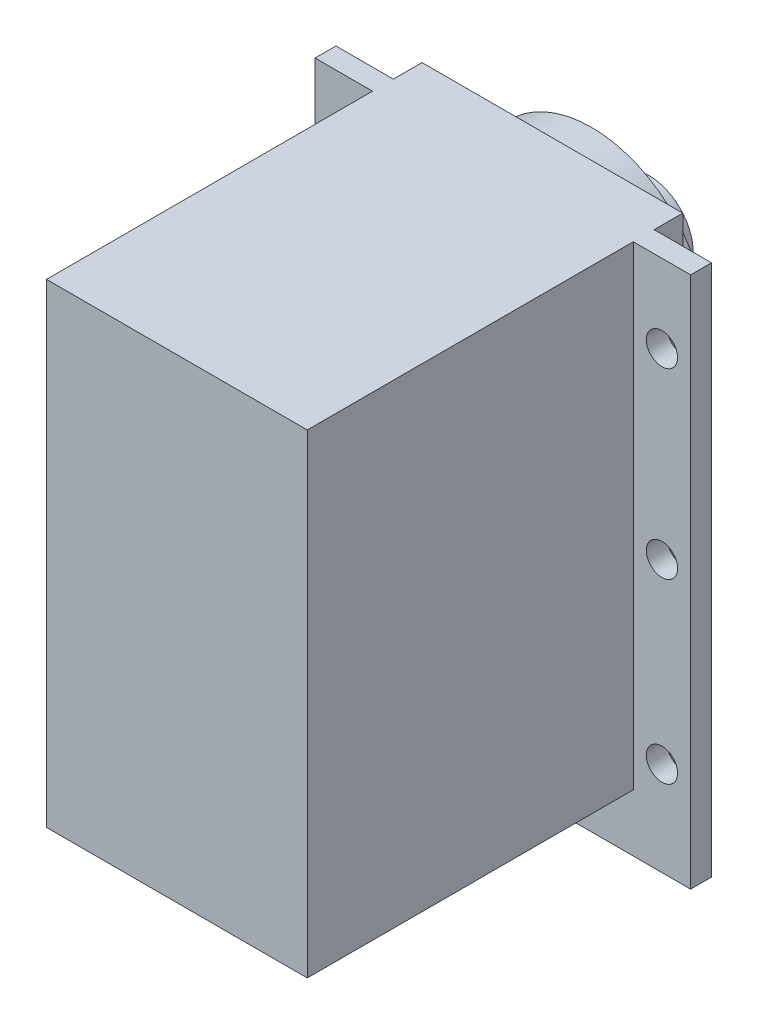
ISO-10303-21;
HEADER;
FILE_DESCRIPTION(('STEP AP214'),'2;1');
FILE_NAME('part.step','',(''),(''),'','','');
FILE_SCHEMA(('AUTOMOTIVE_DESIGN { 1 0 10303 214 1 1 1 1 }'));
ENDSEC;
DATA;
#1=APPLICATION_CONTEXT('core data for automotive mechanical design processes');
#2=APPLICATION_PROTOCOL_DEFINITION('international standard','automotive_design',2000,#1);
#3=PRODUCT_CONTEXT('',#1,'mechanical');
#4=PRODUCT('Part','Part','',(#3));
#5=PRODUCT_RELATED_PRODUCT_CATEGORY('part','',(#4));
#6=PRODUCT_DEFINITION_FORMATION('','',#4);
#7=PRODUCT_DEFINITION_CONTEXT('part definition',#1,'design');
#8=PRODUCT_DEFINITION('design','',#6,#7);
#9=PRODUCT_DEFINITION_SHAPE('','',#8);
#10=(LENGTH_UNIT() NAMED_UNIT(*) SI_UNIT(.MILLI.,.METRE.));
#11=(NAMED_UNIT(*) PLANE_ANGLE_UNIT() SI_UNIT($,.RADIAN.));
#12=(NAMED_UNIT(*) SI_UNIT($,.STERADIAN.) SOLID_ANGLE_UNIT());
#13=UNCERTAINTY_MEASURE_WITH_UNIT(LENGTH_MEASURE(1.E-05),#10,'distance_accuracy_value','');
#14=(GEOMETRIC_REPRESENTATION_CONTEXT(3) GLOBAL_UNCERTAINTY_ASSIGNED_CONTEXT((#13)) GLOBAL_UNIT_ASSIGNED_CONTEXT((#10,
#11,#12)) REPRESENTATION_CONTEXT('',''));
#15=CARTESIAN_POINT('',(0.,0.,0.));
#16=DIRECTION('',(0.,0.,1.));
#17=DIRECTION('',(1.,0.,0.));
#18=AXIS2_PLACEMENT_3D('',#15,#16,#17);
#19=CARTESIAN_POINT('',(12.5,-22.75,36.));
#20=DIRECTION('',(-1.,0.,0.));
#21=DIRECTION('',(0.,0.,1.));
#22=AXIS2_PLACEMENT_3D('',#19,#20,#21);
#23=PLANE('',#22);
#24=DIRECTION('',(0.,-1.,0.));
#25=VECTOR('',#24,1.);
#26=CARTESIAN_POINT('',(12.5,-22.75,4.75));
#27=LINE('',#26,#25);
#28=CARTESIAN_POINT('',(12.5,22.75,4.75));
#29=VERTEX_POINT('',#28);
#30=CARTESIAN_POINT('',(12.5,-22.75,4.75));
#31=VERTEX_POINT('',#30);
#32=EDGE_CURVE('E185',#29,#31,#27,.T.);
#33=ORIENTED_EDGE('',*,*,#32,.F.);
#34=DIRECTION('',(0.,0.,-1.));
#35=VECTOR('',#34,1.);
#36=CARTESIAN_POINT('',(12.5,22.75,36.));
#37=LINE('',#36,#35);
#38=CARTESIAN_POINT('',(12.5,22.75,36.));
#39=VERTEX_POINT('',#38);
#40=EDGE_CURVE('E215',#39,#29,#37,.T.);
#41=ORIENTED_EDGE('',*,*,#40,.F.);
#42=DIRECTION('',(0.,1.,0.));
#43=VECTOR('',#42,1.);
#44=CARTESIAN_POINT('',(12.5,-22.75,36.));
#45=LINE('',#44,#43);
#46=CARTESIAN_POINT('',(12.5,-22.75,36.));
#47=VERTEX_POINT('',#46);
#48=EDGE_CURVE('E188',#47,#39,#45,.T.);
#49=ORIENTED_EDGE('',*,*,#48,.F.);
#50=DIRECTION('',(0.,0.,-1.));
#51=VECTOR('',#50,1.);
#52=CARTESIAN_POINT('',(12.5,-22.75,36.));
#53=LINE('',#52,#51);
#54=EDGE_CURVE('E203',#47,#31,#53,.T.);
#55=ORIENTED_EDGE('',*,*,#54,.T.);
#56=EDGE_LOOP('',(#33,#41,#49,#55));
#57=FACE_BOUND('',#56,.T.);
#58=ADVANCED_FACE('F32',(#57),#23,.F.);
#59=CARTESIAN_POINT('',(-12.5,-22.75,36.));
#60=DIRECTION('',(1.,0.,0.));
#61=DIRECTION('',(0.,0.,-1.));
#62=AXIS2_PLACEMENT_3D('',#59,#60,#61);
#63=PLANE('',#62);
#64=DIRECTION('',(0.,1.,0.));
#65=VECTOR('',#64,1.);
#66=CARTESIAN_POINT('',(-12.5,-22.75,4.75));
#67=LINE('',#66,#65);
#68=CARTESIAN_POINT('',(-12.5,-22.75,4.75));
#69=VERTEX_POINT('',#68);
#70=CARTESIAN_POINT('',(-12.5,22.75,4.75));
#71=VERTEX_POINT('',#70);
#72=EDGE_CURVE('E183',#69,#71,#67,.T.);
#73=ORIENTED_EDGE('',*,*,#72,.F.);
#74=DIRECTION('',(0.,0.,-1.));
#75=VECTOR('',#74,1.);
#76=CARTESIAN_POINT('',(-12.5,-22.75,36.));
#77=LINE('',#76,#75);
#78=CARTESIAN_POINT('',(-12.5,-22.75,36.));
#79=VERTEX_POINT('',#78);
#80=EDGE_CURVE('E207',#79,#69,#77,.T.);
#81=ORIENTED_EDGE('',*,*,#80,.F.);
#82=DIRECTION('',(0.,-1.,0.));
#83=VECTOR('',#82,1.);
#84=CARTESIAN_POINT('',(-12.5,-22.75,36.));
#85=LINE('',#84,#83);
#86=CARTESIAN_POINT('',(-12.5,22.75,36.));
#87=VERTEX_POINT('',#86);
#88=EDGE_CURVE('E192',#87,#79,#85,.T.);
#89=ORIENTED_EDGE('',*,*,#88,.F.);
#90=DIRECTION('',(0.,0.,-1.));
#91=VECTOR('',#90,1.);
#92=CARTESIAN_POINT('',(-12.5,22.75,36.));
#93=LINE('',#92,#91);
#94=EDGE_CURVE('E211',#87,#71,#93,.T.);
#95=ORIENTED_EDGE('',*,*,#94,.T.);
#96=EDGE_LOOP('',(#73,#81,#89,#95));
#97=FACE_BOUND('',#96,.T.);
#98=ADVANCED_FACE('F240',(#97),#63,.F.);
#99=CARTESIAN_POINT('',(-12.5,-22.75,36.));
#100=DIRECTION('',(0.,1.,0.));
#101=DIRECTION('',(0.,0.,1.));
#102=AXIS2_PLACEMENT_3D('',#99,#100,#101);
#103=PLANE('',#102);
#104=DIRECTION('',(-1.,0.,0.));
#105=VECTOR('',#104,1.);
#106=CARTESIAN_POINT('',(-12.5,-22.75,4.75));
#107=LINE('',#106,#105);
#108=EDGE_CURVE('E11',#31,#69,#107,.T.);
#109=ORIENTED_EDGE('',*,*,#108,.F.);
#110=ORIENTED_EDGE('',*,*,#54,.F.);
#111=DIRECTION('',(1.,0.,0.));
#112=VECTOR('',#111,1.);
#113=CARTESIAN_POINT('',(-12.5,-22.75,36.));
#114=LINE('',#113,#112);
#115=EDGE_CURVE('E56',#79,#47,#114,.T.);
#116=ORIENTED_EDGE('',*,*,#115,.F.);
#117=ORIENTED_EDGE('',*,*,#80,.T.);
#118=EDGE_LOOP('',(#109,#110,#116,#117));
#119=FACE_BOUND('',#118,.T.);
#120=ADVANCED_FACE('F243',(#119),#103,.F.);
#121=CARTESIAN_POINT('',(12.5,22.75,2.75));
#122=VERTEX_POINT('',#121);
#123=CARTESIAN_POINT('',(12.5,22.75,0.));
#124=VERTEX_POINT('',#123);
#125=EDGE_CURVE('E214',#122,#124,#37,.T.);
#126=ORIENTED_EDGE('',*,*,#125,.F.);
#127=DIRECTION('',(0.,-1.,0.));
#128=VECTOR('',#127,1.);
#129=CARTESIAN_POINT('',(12.5,-22.75,2.75));
#130=LINE('',#129,#128);
#131=CARTESIAN_POINT('',(12.5,-22.75,2.75));
#132=VERTEX_POINT('',#131);
#133=EDGE_CURVE('E181',#122,#132,#130,.T.);
#134=ORIENTED_EDGE('',*,*,#133,.T.);
#135=CARTESIAN_POINT('',(12.5,-22.75,0.));
#136=VERTEX_POINT('',#135);
#137=EDGE_CURVE('E78',#132,#136,#53,.T.);
#138=ORIENTED_EDGE('',*,*,#137,.T.);
#139=DIRECTION('',(0.,1.,0.));
#140=VECTOR('',#139,1.);
#141=CARTESIAN_POINT('',(12.5,-22.75,0.));
#142=LINE('',#141,#140);
#143=EDGE_CURVE('E187',#136,#124,#142,.T.);
#144=ORIENTED_EDGE('',*,*,#143,.T.);
#145=EDGE_LOOP('',(#126,#134,#138,#144));
#146=FACE_BOUND('',#145,.T.);
#147=ADVANCED_FACE('F34',(#146),#23,.F.);
#148=CARTESIAN_POINT('',(-12.5,22.75,36.));
#149=DIRECTION('',(0.,-1.,0.));
#150=DIRECTION('',(0.,0.,-1.));
#151=AXIS2_PLACEMENT_3D('',#148,#149,#150);
#152=PLANE('',#151);
#153=CARTESIAN_POINT('',(-12.5,22.75,2.75));
#154=VERTEX_POINT('',#153);
#155=CARTESIAN_POINT('',(-12.5,22.75,0.));
#156=VERTEX_POINT('',#155);
#157=EDGE_CURVE('E210',#154,#156,#93,.T.);
#158=ORIENTED_EDGE('',*,*,#157,.F.);
#159=DIRECTION('',(1.,0.,0.));
#160=VECTOR('',#159,1.);
#161=CARTESIAN_POINT('',(18.,22.75,2.75));
#162=LINE('',#161,#160);
#163=CARTESIAN_POINT('',(-18.,22.75,2.75));
#164=VERTEX_POINT('',#163);
#165=EDGE_CURVE('E157',#164,#154,#162,.T.);
#166=ORIENTED_EDGE('',*,*,#165,.F.);
#167=DIRECTION('',(0.,0.,-1.));
#168=VECTOR('',#167,1.);
#169=CARTESIAN_POINT('',(-18.,22.75,4.75));
#170=LINE('',#169,#168);
#171=CARTESIAN_POINT('',(-18.,22.75,4.75));
#172=VERTEX_POINT('',#171);
#173=EDGE_CURVE('E177',#172,#164,#170,.T.);
#174=ORIENTED_EDGE('',*,*,#173,.F.);
#175=DIRECTION('',(1.,0.,0.));
#176=VECTOR('',#175,1.);
#177=CARTESIAN_POINT('',(18.,22.75,4.75));
#178=LINE('',#177,#176);
#179=EDGE_CURVE('E142',#172,#71,#178,.T.);
#180=ORIENTED_EDGE('',*,*,#179,.T.);
#181=ORIENTED_EDGE('',*,*,#94,.F.);
#182=DIRECTION('',(-1.,0.,0.));
#183=VECTOR('',#182,1.);
#184=CARTESIAN_POINT('',(-12.5,22.75,36.));
#185=LINE('',#184,#183);
#186=EDGE_CURVE('E86',#39,#87,#185,.T.);
#187=ORIENTED_EDGE('',*,*,#186,.F.);
#188=ORIENTED_EDGE('',*,*,#40,.T.);
#189=CARTESIAN_POINT('',(18.,22.75,4.75));
#190=VERTEX_POINT('',#189);
#191=EDGE_CURVE('E166',#29,#190,#178,.T.);
#192=ORIENTED_EDGE('',*,*,#191,.T.);
#193=DIRECTION('',(0.,0.,-1.));
#194=VECTOR('',#193,1.);
#195=CARTESIAN_POINT('',(18.,22.75,4.75));
#196=LINE('',#195,#194);
#197=CARTESIAN_POINT('',(18.,22.75,2.75));
#198=VERTEX_POINT('',#197);
#199=EDGE_CURVE('E156',#190,#198,#196,.T.);
#200=ORIENTED_EDGE('',*,*,#199,.T.);
#201=EDGE_CURVE('E159',#122,#198,#162,.T.);
#202=ORIENTED_EDGE('',*,*,#201,.F.);
#203=ORIENTED_EDGE('',*,*,#125,.T.);
#204=DIRECTION('',(-1.,0.,0.));
#205=VECTOR('',#204,1.);
#206=CARTESIAN_POINT('',(-12.5,22.75,0.));
#207=LINE('',#206,#205);
#208=EDGE_CURVE('E196',#124,#156,#207,.T.);
#209=ORIENTED_EDGE('',*,*,#208,.T.);
#210=EDGE_LOOP('',(#158,#166,#174,#180,#181,#187,#188,#192,#200,#202,#203,#209));
#211=FACE_BOUND('',#210,.T.);
#212=ADVANCED_FACE('F230',(#211),#152,.F.);
#213=CARTESIAN_POINT('',(-12.5,-22.75,2.75));
#214=VERTEX_POINT('',#213);
#215=CARTESIAN_POINT('',(-12.5,-22.75,0.));
#216=VERTEX_POINT('',#215);
#217=EDGE_CURVE('E206',#214,#216,#77,.T.);
#218=ORIENTED_EDGE('',*,*,#217,.F.);
#219=DIRECTION('',(0.,1.,0.));
#220=VECTOR('',#219,1.);
#221=CARTESIAN_POINT('',(-12.5,-22.75,2.75));
#222=LINE('',#221,#220);
#223=EDGE_CURVE('E47',#214,#154,#222,.T.);
#224=ORIENTED_EDGE('',*,*,#223,.T.);
#225=ORIENTED_EDGE('',*,*,#157,.T.);
#226=DIRECTION('',(0.,-1.,0.));
#227=VECTOR('',#226,1.);
#228=CARTESIAN_POINT('',(-12.5,-22.75,0.));
#229=LINE('',#228,#227);
#230=EDGE_CURVE('E199',#156,#216,#229,.T.);
#231=ORIENTED_EDGE('',*,*,#230,.T.);
#232=EDGE_LOOP('',(#218,#224,#225,#231));
#233=FACE_BOUND('',#232,.T.);
#234=ADVANCED_FACE('F220',(#233),#63,.F.);
#235=ORIENTED_EDGE('',*,*,#137,.F.);
#236=DIRECTION('',(-1.,0.,0.));
#237=VECTOR('',#236,1.);
#238=CARTESIAN_POINT('',(-12.5,-22.75,2.75));
#239=LINE('',#238,#237);
#240=EDGE_CURVE('E40',#132,#214,#239,.T.);
#241=ORIENTED_EDGE('',*,*,#240,.T.);
#242=ORIENTED_EDGE('',*,*,#217,.T.);
#243=DIRECTION('',(1.,0.,0.));
#244=VECTOR('',#243,1.);
#245=CARTESIAN_POINT('',(-12.5,-22.75,0.));
#246=LINE('',#245,#244);
#247=EDGE_CURVE('E190',#216,#136,#246,.T.);
#248=ORIENTED_EDGE('',*,*,#247,.T.);
#249=EDGE_LOOP('',(#235,#241,#242,#248));
#250=FACE_BOUND('',#249,.T.);
#251=ADVANCED_FACE('F218',(#250),#103,.F.);
#252=CARTESIAN_POINT('',(0.,0.,36.));
#253=DIRECTION('',(0.,0.,-1.));
#254=DIRECTION('',(-1.,0.,0.));
#255=AXIS2_PLACEMENT_3D('',#252,#253,#254);
#256=PLANE('',#255);
#257=ORIENTED_EDGE('',*,*,#48,.T.);
#258=ORIENTED_EDGE('',*,*,#186,.T.);
#259=ORIENTED_EDGE('',*,*,#88,.T.);
#260=ORIENTED_EDGE('',*,*,#115,.T.);
#261=EDGE_LOOP('',(#257,#258,#259,#260));
#262=FACE_BOUND('',#261,.T.);
#263=ADVANCED_FACE('F248',(#262),#256,.F.);
#264=CARTESIAN_POINT('',(0.,0.,0.));
#265=DIRECTION('',(0.,0.,-1.));
#266=DIRECTION('',(-1.,0.,0.));
#267=AXIS2_PLACEMENT_3D('',#264,#265,#266);
#268=PLANE('',#267);
#269=CARTESIAN_POINT('',(0.,10.75,0.));
#270=DIRECTION('',(0.,0.,-1.));
#271=DIRECTION('',(-1.,0.,0.));
#272=AXIS2_PLACEMENT_3D('',#269,#270,#271);
#273=CIRCLE('',#272,11.);
#274=CARTESIAN_POINT('',(-11.,10.75,0.));
#275=VERTEX_POINT('',#274);
#276=EDGE_CURVE('E668',#275,#275,#273,.T.);
#277=ORIENTED_EDGE('',*,*,#276,.F.);
#278=EDGE_LOOP('',(#277));
#279=FACE_BOUND('',#278,.T.);
#280=ORIENTED_EDGE('',*,*,#143,.F.);
#281=ORIENTED_EDGE('',*,*,#247,.F.);
#282=ORIENTED_EDGE('',*,*,#230,.F.);
#283=ORIENTED_EDGE('',*,*,#208,.F.);
#284=EDGE_LOOP('',(#280,#281,#282,#283));
#285=FACE_BOUND('',#284,.T.);
#286=ADVANCED_FACE('F227',(#279,#285),#268,.T.);
#287=CARTESIAN_POINT('',(0.,0.,4.75));
#288=DIRECTION('',(0.,0.,-1.));
#289=DIRECTION('',(-1.,0.,0.));
#290=AXIS2_PLACEMENT_3D('',#287,#288,#289);
#291=PLANE('',#290);
#292=CARTESIAN_POINT('',(-15.25,15.25,4.75));
#293=DIRECTION('',(0.,0.,-1.));
#294=DIRECTION('',(-1.,0.,0.));
#295=AXIS2_PLACEMENT_3D('',#292,#293,#294);
#296=CIRCLE('',#295,1.5);
#297=CARTESIAN_POINT('',(-16.75,15.25,4.75));
#298=VERTEX_POINT('',#297);
#299=EDGE_CURVE('E677',#298,#298,#296,.T.);
#300=ORIENTED_EDGE('',*,*,#299,.T.);
#301=EDGE_LOOP('',(#300));
#302=FACE_BOUND('',#301,.T.);
#303=CARTESIAN_POINT('',(-15.25,-2.25,4.75));
#304=DIRECTION('',(0.,0.,-1.));
#305=DIRECTION('',(-1.,0.,0.));
#306=AXIS2_PLACEMENT_3D('',#303,#304,#305);
#307=CIRCLE('',#306,1.5);
#308=CARTESIAN_POINT('',(-16.75,-2.25,4.75));
#309=VERTEX_POINT('',#308);
#310=EDGE_CURVE('E683',#309,#309,#307,.T.);
#311=ORIENTED_EDGE('',*,*,#310,.T.);
#312=EDGE_LOOP('',(#311));
#313=FACE_BOUND('',#312,.T.);
#314=CARTESIAN_POINT('',(-15.25,-19.25,4.75));
#315=DIRECTION('',(0.,0.,-1.));
#316=DIRECTION('',(-1.,0.,0.));
#317=AXIS2_PLACEMENT_3D('',#314,#315,#316);
#318=CIRCLE('',#317,1.5);
#319=CARTESIAN_POINT('',(-16.75,-19.25,4.75));
#320=VERTEX_POINT('',#319);
#321=EDGE_CURVE('E689',#320,#320,#318,.T.);
#322=ORIENTED_EDGE('',*,*,#321,.T.);
#323=EDGE_LOOP('',(#322));
#324=FACE_BOUND('',#323,.T.);
#325=CARTESIAN_POINT('',(-7.5,-25.5,4.75));
#326=DIRECTION('',(0.,0.,-1.));
#327=DIRECTION('',(-1.,0.,0.));
#328=AXIS2_PLACEMENT_3D('',#325,#326,#327);
#329=CIRCLE('',#328,1.5);
#330=CARTESIAN_POINT('',(-9.,-25.5,4.75));
#331=VERTEX_POINT('',#330);
#332=EDGE_CURVE('E695',#331,#331,#329,.T.);
#333=ORIENTED_EDGE('',*,*,#332,.T.);
#334=EDGE_LOOP('',(#333));
#335=FACE_BOUND('',#334,.T.);
#336=CARTESIAN_POINT('',(7.5,-25.5,4.75));
#337=DIRECTION('',(0.,0.,-1.));
#338=DIRECTION('',(-1.,0.,0.));
#339=AXIS2_PLACEMENT_3D('',#336,#337,#338);
#340=CIRCLE('',#339,1.5);
#341=CARTESIAN_POINT('',(6.,-25.5,4.75));
#342=VERTEX_POINT('',#341);
#343=EDGE_CURVE('E701',#342,#342,#340,.T.);
#344=ORIENTED_EDGE('',*,*,#343,.T.);
#345=EDGE_LOOP('',(#344));
#346=FACE_BOUND('',#345,.T.);
#347=CARTESIAN_POINT('',(15.25,-19.25,4.75));
#348=DIRECTION('',(0.,0.,-1.));
#349=DIRECTION('',(-1.,0.,0.));
#350=AXIS2_PLACEMENT_3D('',#347,#348,#349);
#351=CIRCLE('',#350,1.5);
#352=CARTESIAN_POINT('',(13.75,-19.25,4.75));
#353=VERTEX_POINT('',#352);
#354=EDGE_CURVE('E707',#353,#353,#351,.T.);
#355=ORIENTED_EDGE('',*,*,#354,.T.);
#356=EDGE_LOOP('',(#355));
#357=FACE_BOUND('',#356,.T.);
#358=CARTESIAN_POINT('',(15.25,-2.25,4.75));
#359=DIRECTION('',(0.,0.,-1.));
#360=DIRECTION('',(-1.,0.,0.));
#361=AXIS2_PLACEMENT_3D('',#358,#359,#360);
#362=CIRCLE('',#361,1.5);
#363=CARTESIAN_POINT('',(13.75,-2.25,4.75));
#364=VERTEX_POINT('',#363);
#365=EDGE_CURVE('E713',#364,#364,#362,.T.);
#366=ORIENTED_EDGE('',*,*,#365,.T.);
#367=EDGE_LOOP('',(#366));
#368=FACE_BOUND('',#367,.T.);
#369=CARTESIAN_POINT('',(15.25,15.25,4.75));
#370=DIRECTION('',(0.,0.,-1.));
#371=DIRECTION('',(-1.,0.,0.));
#372=AXIS2_PLACEMENT_3D('',#369,#370,#371);
#373=CIRCLE('',#372,1.5);
#374=CARTESIAN_POINT('',(13.75,15.25,4.75));
#375=VERTEX_POINT('',#374);
#376=EDGE_CURVE('E171',#375,#375,#373,.T.);
#377=ORIENTED_EDGE('',*,*,#376,.T.);
#378=EDGE_LOOP('',(#377));
#379=FACE_BOUND('',#378,.T.);
#380=ORIENTED_EDGE('',*,*,#191,.F.);
#381=ORIENTED_EDGE('',*,*,#32,.T.);
#382=ORIENTED_EDGE('',*,*,#108,.T.);
#383=ORIENTED_EDGE('',*,*,#72,.T.);
#384=ORIENTED_EDGE('',*,*,#179,.F.);
#385=DIRECTION('',(0.,1.,0.));
#386=VECTOR('',#385,1.);
#387=CARTESIAN_POINT('',(-18.,22.75,4.75));
#388=LINE('',#387,#386);
#389=CARTESIAN_POINT('',(-18.,-28.25,4.75));
#390=VERTEX_POINT('',#389);
#391=EDGE_CURVE('E151',#390,#172,#388,.T.);
#392=ORIENTED_EDGE('',*,*,#391,.F.);
#393=DIRECTION('',(-1.,0.,0.));
#394=VECTOR('',#393,1.);
#395=CARTESIAN_POINT('',(18.,-28.25,4.75));
#396=LINE('',#395,#394);
#397=CARTESIAN_POINT('',(18.,-28.25,4.75));
#398=VERTEX_POINT('',#397);
#399=EDGE_CURVE('E134',#398,#390,#396,.T.);
#400=ORIENTED_EDGE('',*,*,#399,.F.);
#401=DIRECTION('',(0.,-1.,0.));
#402=VECTOR('',#401,1.);
#403=CARTESIAN_POINT('',(18.,22.75,4.75));
#404=LINE('',#403,#402);
#405=EDGE_CURVE('E148',#190,#398,#404,.T.);
#406=ORIENTED_EDGE('',*,*,#405,.F.);
#407=EDGE_LOOP('',(#380,#381,#382,#383,#384,#392,#400,#406));
#408=FACE_BOUND('',#407,.T.);
#409=ADVANCED_FACE('F147',(#302,#313,#324,#335,#346,#357,#368,#379,#408),#291,.F.);
#410=CARTESIAN_POINT('',(0.,0.,2.75));
#411=DIRECTION('',(0.,0.,-1.));
#412=DIRECTION('',(-1.,0.,0.));
#413=AXIS2_PLACEMENT_3D('',#410,#411,#412);
#414=PLANE('',#413);
#415=CARTESIAN_POINT('',(15.25,15.25,2.75));
#416=DIRECTION('',(0.,0.,-1.));
#417=DIRECTION('',(-1.,0.,0.));
#418=AXIS2_PLACEMENT_3D('',#415,#416,#417);
#419=CIRCLE('',#418,1.5);
#420=CARTESIAN_POINT('',(13.75,15.25,2.75));
#421=VERTEX_POINT('',#420);
#422=EDGE_CURVE('E162',#421,#421,#419,.T.);
#423=ORIENTED_EDGE('',*,*,#422,.F.);
#424=EDGE_LOOP('',(#423));
#425=FACE_BOUND('',#424,.T.);
#426=CARTESIAN_POINT('',(15.25,-2.25,2.75));
#427=DIRECTION('',(0.,0.,-1.));
#428=DIRECTION('',(-1.,0.,0.));
#429=AXIS2_PLACEMENT_3D('',#426,#427,#428);
#430=CIRCLE('',#429,1.5);
#431=CARTESIAN_POINT('',(13.75,-2.25,2.75));
#432=VERTEX_POINT('',#431);
#433=EDGE_CURVE('E710',#432,#432,#430,.T.);
#434=ORIENTED_EDGE('',*,*,#433,.F.);
#435=EDGE_LOOP('',(#434));
#436=FACE_BOUND('',#435,.T.);
#437=CARTESIAN_POINT('',(15.25,-19.25,2.75));
#438=DIRECTION('',(0.,0.,-1.));
#439=DIRECTION('',(-1.,0.,0.));
#440=AXIS2_PLACEMENT_3D('',#437,#438,#439);
#441=CIRCLE('',#440,1.5);
#442=CARTESIAN_POINT('',(13.75,-19.25,2.75));
#443=VERTEX_POINT('',#442);
#444=EDGE_CURVE('E704',#443,#443,#441,.T.);
#445=ORIENTED_EDGE('',*,*,#444,.F.);
#446=EDGE_LOOP('',(#445));
#447=FACE_BOUND('',#446,.T.);
#448=CARTESIAN_POINT('',(7.5,-25.5,2.75));
#449=DIRECTION('',(0.,0.,-1.));
#450=DIRECTION('',(-1.,0.,0.));
#451=AXIS2_PLACEMENT_3D('',#448,#449,#450);
#452=CIRCLE('',#451,1.5);
#453=CARTESIAN_POINT('',(6.,-25.5,2.75));
#454=VERTEX_POINT('',#453);
#455=EDGE_CURVE('E698',#454,#454,#452,.T.);
#456=ORIENTED_EDGE('',*,*,#455,.F.);
#457=EDGE_LOOP('',(#456));
#458=FACE_BOUND('',#457,.T.);
#459=CARTESIAN_POINT('',(-7.5,-25.5,2.75));
#460=DIRECTION('',(0.,0.,-1.));
#461=DIRECTION('',(-1.,0.,0.));
#462=AXIS2_PLACEMENT_3D('',#459,#460,#461);
#463=CIRCLE('',#462,1.5);
#464=CARTESIAN_POINT('',(-9.,-25.5,2.75));
#465=VERTEX_POINT('',#464);
#466=EDGE_CURVE('E692',#465,#465,#463,.T.);
#467=ORIENTED_EDGE('',*,*,#466,.F.);
#468=EDGE_LOOP('',(#467));
#469=FACE_BOUND('',#468,.T.);
#470=CARTESIAN_POINT('',(-15.25,-19.25,2.75));
#471=DIRECTION('',(0.,0.,-1.));
#472=DIRECTION('',(-1.,0.,0.));
#473=AXIS2_PLACEMENT_3D('',#470,#471,#472);
#474=CIRCLE('',#473,1.5);
#475=CARTESIAN_POINT('',(-16.75,-19.25,2.75));
#476=VERTEX_POINT('',#475);
#477=EDGE_CURVE('E686',#476,#476,#474,.T.);
#478=ORIENTED_EDGE('',*,*,#477,.F.);
#479=EDGE_LOOP('',(#478));
#480=FACE_BOUND('',#479,.T.);
#481=CARTESIAN_POINT('',(-15.25,-2.25,2.75));
#482=DIRECTION('',(0.,0.,-1.));
#483=DIRECTION('',(-1.,0.,0.));
#484=AXIS2_PLACEMENT_3D('',#481,#482,#483);
#485=CIRCLE('',#484,1.5);
#486=CARTESIAN_POINT('',(-16.75,-2.25,2.75));
#487=VERTEX_POINT('',#486);
#488=EDGE_CURVE('E680',#487,#487,#485,.T.);
#489=ORIENTED_EDGE('',*,*,#488,.F.);
#490=EDGE_LOOP('',(#489));
#491=FACE_BOUND('',#490,.T.);
#492=CARTESIAN_POINT('',(-15.25,15.25,2.75));
#493=DIRECTION('',(0.,0.,-1.));
#494=DIRECTION('',(-1.,0.,0.));
#495=AXIS2_PLACEMENT_3D('',#492,#493,#494);
#496=CIRCLE('',#495,1.5);
#497=CARTESIAN_POINT('',(-16.75,15.25,2.75));
#498=VERTEX_POINT('',#497);
#499=EDGE_CURVE('E674',#498,#498,#496,.T.);
#500=ORIENTED_EDGE('',*,*,#499,.F.);
#501=EDGE_LOOP('',(#500));
#502=FACE_BOUND('',#501,.T.);
#503=ORIENTED_EDGE('',*,*,#133,.F.);
#504=ORIENTED_EDGE('',*,*,#201,.T.);
#505=DIRECTION('',(0.,-1.,0.));
#506=VECTOR('',#505,1.);
#507=CARTESIAN_POINT('',(18.,22.75,2.75));
#508=LINE('',#507,#506);
#509=CARTESIAN_POINT('',(18.,-28.25,2.75));
#510=VERTEX_POINT('',#509);
#511=EDGE_CURVE('E169',#198,#510,#508,.T.);
#512=ORIENTED_EDGE('',*,*,#511,.T.);
#513=DIRECTION('',(-1.,0.,0.));
#514=VECTOR('',#513,1.);
#515=CARTESIAN_POINT('',(18.,-28.25,2.75));
#516=LINE('',#515,#514);
#517=CARTESIAN_POINT('',(-18.,-28.25,2.75));
#518=VERTEX_POINT('',#517);
#519=EDGE_CURVE('E136',#510,#518,#516,.T.);
#520=ORIENTED_EDGE('',*,*,#519,.T.);
#521=DIRECTION('',(0.,1.,0.));
#522=VECTOR('',#521,1.);
#523=CARTESIAN_POINT('',(-18.,22.75,2.75));
#524=LINE('',#523,#522);
#525=EDGE_CURVE('E173',#518,#164,#524,.T.);
#526=ORIENTED_EDGE('',*,*,#525,.T.);
#527=ORIENTED_EDGE('',*,*,#165,.T.);
#528=ORIENTED_EDGE('',*,*,#223,.F.);
#529=ORIENTED_EDGE('',*,*,#240,.F.);
#530=EDGE_LOOP('',(#503,#504,#512,#520,#526,#527,#528,#529));
#531=FACE_BOUND('',#530,.T.);
#532=ADVANCED_FACE('F231',(#425,#436,#447,#458,#469,#480,#491,#502,#531),#414,.T.);
#533=CARTESIAN_POINT('',(18.,22.75,4.75));
#534=DIRECTION('',(1.,0.,0.));
#535=DIRECTION('',(0.,1.,0.));
#536=AXIS2_PLACEMENT_3D('',#533,#534,#535);
#537=PLANE('',#536);
#538=ORIENTED_EDGE('',*,*,#511,.F.);
#539=ORIENTED_EDGE('',*,*,#199,.F.);
#540=ORIENTED_EDGE('',*,*,#405,.T.);
#541=DIRECTION('',(0.,0.,-1.));
#542=VECTOR('',#541,1.);
#543=CARTESIAN_POINT('',(18.,-28.25,4.75));
#544=LINE('',#543,#542);
#545=EDGE_CURVE('E131',#398,#510,#544,.T.);
#546=ORIENTED_EDGE('',*,*,#545,.T.);
#547=EDGE_LOOP('',(#538,#539,#540,#546));
#548=FACE_BOUND('',#547,.T.);
#549=ADVANCED_FACE('F154',(#548),#537,.T.);
#550=CARTESIAN_POINT('',(-18.,22.75,4.75));
#551=DIRECTION('',(-1.,0.,0.));
#552=DIRECTION('',(0.,0.,1.));
#553=AXIS2_PLACEMENT_3D('',#550,#551,#552);
#554=PLANE('',#553);
#555=ORIENTED_EDGE('',*,*,#525,.F.);
#556=DIRECTION('',(0.,0.,-1.));
#557=VECTOR('',#556,1.);
#558=CARTESIAN_POINT('',(-18.,-28.25,4.75));
#559=LINE('',#558,#557);
#560=EDGE_CURVE('E141',#390,#518,#559,.T.);
#561=ORIENTED_EDGE('',*,*,#560,.F.);
#562=ORIENTED_EDGE('',*,*,#391,.T.);
#563=ORIENTED_EDGE('',*,*,#173,.T.);
#564=EDGE_LOOP('',(#555,#561,#562,#563));
#565=FACE_BOUND('',#564,.T.);
#566=ADVANCED_FACE('F235',(#565),#554,.T.);
#567=CARTESIAN_POINT('',(18.,-28.25,4.75));
#568=DIRECTION('',(0.,-1.,0.));
#569=DIRECTION('',(0.,0.,-1.));
#570=AXIS2_PLACEMENT_3D('',#567,#568,#569);
#571=PLANE('',#570);
#572=ORIENTED_EDGE('',*,*,#519,.F.);
#573=ORIENTED_EDGE('',*,*,#545,.F.);
#574=ORIENTED_EDGE('',*,*,#399,.T.);
#575=ORIENTED_EDGE('',*,*,#560,.T.);
#576=EDGE_LOOP('',(#572,#573,#574,#575));
#577=FACE_BOUND('',#576,.T.);
#578=ADVANCED_FACE('F133',(#577),#571,.T.);
#579=CARTESIAN_POINT('',(15.25,15.25,4.75));
#580=DIRECTION('',(0.,0.,-1.));
#581=DIRECTION('',(-1.,0.,0.));
#582=AXIS2_PLACEMENT_3D('',#579,#580,#581);
#583=CYLINDRICAL_SURFACE('',#582,1.5);
#584=ORIENTED_EDGE('',*,*,#376,.F.);
#585=EDGE_LOOP('',(#584));
#586=FACE_BOUND('',#585,.T.);
#587=ORIENTED_EDGE('',*,*,#422,.T.);
#588=EDGE_LOOP('',(#587));
#589=FACE_BOUND('',#588,.T.);
#590=ADVANCED_FACE('F324',(#586,#589),#583,.F.);
#591=CARTESIAN_POINT('',(15.25,-2.25,4.75));
#592=DIRECTION('',(0.,0.,-1.));
#593=DIRECTION('',(-1.,0.,0.));
#594=AXIS2_PLACEMENT_3D('',#591,#592,#593);
#595=CYLINDRICAL_SURFACE('',#594,1.5);
#596=ORIENTED_EDGE('',*,*,#365,.F.);
#597=EDGE_LOOP('',(#596));
#598=FACE_BOUND('',#597,.T.);
#599=ORIENTED_EDGE('',*,*,#433,.T.);
#600=EDGE_LOOP('',(#599));
#601=FACE_BOUND('',#600,.T.);
#602=ADVANCED_FACE('F333',(#598,#601),#595,.F.);
#603=CARTESIAN_POINT('',(15.25,-19.25,4.75));
#604=DIRECTION('',(0.,0.,-1.));
#605=DIRECTION('',(-1.,0.,0.));
#606=AXIS2_PLACEMENT_3D('',#603,#604,#605);
#607=CYLINDRICAL_SURFACE('',#606,1.5);
#608=ORIENTED_EDGE('',*,*,#354,.F.);
#609=EDGE_LOOP('',(#608));
#610=FACE_BOUND('',#609,.T.);
#611=ORIENTED_EDGE('',*,*,#444,.T.);
#612=EDGE_LOOP('',(#611));
#613=FACE_BOUND('',#612,.T.);
#614=ADVANCED_FACE('F343',(#610,#613),#607,.F.);
#615=CARTESIAN_POINT('',(7.5,-25.5,4.75));
#616=DIRECTION('',(0.,0.,-1.));
#617=DIRECTION('',(-1.,0.,0.));
#618=AXIS2_PLACEMENT_3D('',#615,#616,#617);
#619=CYLINDRICAL_SURFACE('',#618,1.5);
#620=ORIENTED_EDGE('',*,*,#343,.F.);
#621=EDGE_LOOP('',(#620));
#622=FACE_BOUND('',#621,.T.);
#623=ORIENTED_EDGE('',*,*,#455,.T.);
#624=EDGE_LOOP('',(#623));
#625=FACE_BOUND('',#624,.T.);
#626=ADVANCED_FACE('F353',(#622,#625),#619,.F.);
#627=CARTESIAN_POINT('',(-7.5,-25.5,4.75));
#628=DIRECTION('',(0.,0.,-1.));
#629=DIRECTION('',(-1.,0.,0.));
#630=AXIS2_PLACEMENT_3D('',#627,#628,#629);
#631=CYLINDRICAL_SURFACE('',#630,1.5);
#632=ORIENTED_EDGE('',*,*,#332,.F.);
#633=EDGE_LOOP('',(#632));
#634=FACE_BOUND('',#633,.T.);
#635=ORIENTED_EDGE('',*,*,#466,.T.);
#636=EDGE_LOOP('',(#635));
#637=FACE_BOUND('',#636,.T.);
#638=ADVANCED_FACE('F363',(#634,#637),#631,.F.);
#639=CARTESIAN_POINT('',(-15.25,-19.25,4.75));
#640=DIRECTION('',(0.,0.,-1.));
#641=DIRECTION('',(-1.,0.,0.));
#642=AXIS2_PLACEMENT_3D('',#639,#640,#641);
#643=CYLINDRICAL_SURFACE('',#642,1.5);
#644=ORIENTED_EDGE('',*,*,#321,.F.);
#645=EDGE_LOOP('',(#644));
#646=FACE_BOUND('',#645,.T.);
#647=ORIENTED_EDGE('',*,*,#477,.T.);
#648=EDGE_LOOP('',(#647));
#649=FACE_BOUND('',#648,.T.);
#650=ADVANCED_FACE('F373',(#646,#649),#643,.F.);
#651=CARTESIAN_POINT('',(-15.25,-2.25,4.75));
#652=DIRECTION('',(0.,0.,-1.));
#653=DIRECTION('',(-1.,0.,0.));
#654=AXIS2_PLACEMENT_3D('',#651,#652,#653);
#655=CYLINDRICAL_SURFACE('',#654,1.5);
#656=ORIENTED_EDGE('',*,*,#310,.F.);
#657=EDGE_LOOP('',(#656));
#658=FACE_BOUND('',#657,.T.);
#659=ORIENTED_EDGE('',*,*,#488,.T.);
#660=EDGE_LOOP('',(#659));
#661=FACE_BOUND('',#660,.T.);
#662=ADVANCED_FACE('F383',(#658,#661),#655,.F.);
#663=CARTESIAN_POINT('',(-15.25,15.25,4.75));
#664=DIRECTION('',(0.,0.,-1.));
#665=DIRECTION('',(-1.,0.,0.));
#666=AXIS2_PLACEMENT_3D('',#663,#664,#665);
#667=CYLINDRICAL_SURFACE('',#666,1.5);
#668=ORIENTED_EDGE('',*,*,#299,.F.);
#669=EDGE_LOOP('',(#668));
#670=FACE_BOUND('',#669,.T.);
#671=ORIENTED_EDGE('',*,*,#499,.T.);
#672=EDGE_LOOP('',(#671));
#673=FACE_BOUND('',#672,.T.);
#674=ADVANCED_FACE('F393',(#670,#673),#667,.F.);
#675=CARTESIAN_POINT('',(0.,10.75,-3.75));
#676=DIRECTION('',(0.,0.,1.));
#677=DIRECTION('',(1.,0.,0.));
#678=AXIS2_PLACEMENT_3D('',#675,#676,#677);
#679=CYLINDRICAL_SURFACE('',#678,11.);
#680=CARTESIAN_POINT('',(0.,10.75,-3.75));
#681=DIRECTION('',(0.,0.,-1.));
#682=DIRECTION('',(-1.,0.,0.));
#683=AXIS2_PLACEMENT_3D('',#680,#681,#682);
#684=CIRCLE('',#683,11.);
#685=CARTESIAN_POINT('',(-11.,10.75,-3.75));
#686=VERTEX_POINT('',#685);
#687=EDGE_CURVE('E671',#686,#686,#684,.T.);
#688=ORIENTED_EDGE('',*,*,#687,.F.);
#689=EDGE_LOOP('',(#688));
#690=FACE_BOUND('',#689,.T.);
#691=ORIENTED_EDGE('',*,*,#276,.T.);
#692=EDGE_LOOP('',(#691));
#693=FACE_BOUND('',#692,.T.);
#694=ADVANCED_FACE('F403',(#690,#693),#679,.T.);
#695=CARTESIAN_POINT('',(0.,10.75,-3.75));
#696=DIRECTION('',(0.,0.,-1.));
#697=DIRECTION('',(-1.,0.,0.));
#698=AXIS2_PLACEMENT_3D('',#695,#696,#697);
#699=PLANE('',#698);
#700=CARTESIAN_POINT('',(0.,10.75,-3.75));
#701=DIRECTION('',(0.,0.,-1.));
#702=DIRECTION('',(-1.,0.,0.));
#703=AXIS2_PLACEMENT_3D('',#700,#701,#702);
#704=CIRCLE('',#703,4.25);
#705=CARTESIAN_POINT('',(-4.25,10.75,-3.75));
#706=VERTEX_POINT('',#705);
#707=EDGE_CURVE('E618',#706,#706,#704,.T.);
#708=ORIENTED_EDGE('',*,*,#707,.F.);
#709=EDGE_LOOP('',(#708));
#710=FACE_BOUND('',#709,.T.);
#711=CARTESIAN_POINT('',(5.65685424949229,16.4068542494923,-3.75));
#712=DIRECTION('',(0.,0.,-1.));
#713=DIRECTION('',(-1.,0.,0.));
#714=AXIS2_PLACEMENT_3D('',#711,#712,#713);
#715=CIRCLE('',#714,1.5);
#716=CARTESIAN_POINT('',(4.15685424949229,16.4068542494923,-3.75));
#717=VERTEX_POINT('',#716);
#718=EDGE_CURVE('E630',#717,#717,#715,.T.);
#719=ORIENTED_EDGE('',*,*,#718,.F.);
#720=EDGE_LOOP('',(#719));
#721=FACE_BOUND('',#720,.T.);
#722=CARTESIAN_POINT('',(7.99999999999982,10.7499999999999,-3.75));
#723=DIRECTION('',(0.,0.,-1.));
#724=DIRECTION('',(-1.,0.,0.));
#725=AXIS2_PLACEMENT_3D('',#722,#723,#724);
#726=CIRCLE('',#725,1.5);
#727=CARTESIAN_POINT('',(6.49999999999982,10.7499999999999,-3.75));
#728=VERTEX_POINT('',#727);
#729=EDGE_CURVE('E636',#728,#728,#726,.T.);
#730=ORIENTED_EDGE('',*,*,#729,.F.);
#731=EDGE_LOOP('',(#730));
#732=FACE_BOUND('',#731,.T.);
#733=CARTESIAN_POINT('',(5.65685424949209,5.09314575050756,-3.75));
#734=DIRECTION('',(0.,0.,-1.));
#735=DIRECTION('',(-1.,0.,0.));
#736=AXIS2_PLACEMENT_3D('',#733,#734,#735);
#737=CIRCLE('',#736,1.5);
#738=CARTESIAN_POINT('',(4.15685424949209,5.09314575050756,-3.75));
#739=VERTEX_POINT('',#738);
#740=EDGE_CURVE('E642',#739,#739,#737,.T.);
#741=ORIENTED_EDGE('',*,*,#740,.F.);
#742=EDGE_LOOP('',(#741));
#743=FACE_BOUND('',#742,.T.);
#744=CARTESIAN_POINT('',(-3.47952440109864E-13,2.75000000000005,-3.75));
#745=DIRECTION('',(0.,0.,-1.));
#746=DIRECTION('',(-1.,0.,0.));
#747=AXIS2_PLACEMENT_3D('',#744,#745,#746);
#748=CIRCLE('',#747,1.5);
#749=CARTESIAN_POINT('',(-1.50000000000035,2.75000000000005,-3.75));
#750=VERTEX_POINT('',#749);
#751=EDGE_CURVE('E648',#750,#750,#748,.T.);
#752=ORIENTED_EDGE('',*,*,#751,.F.);
#753=EDGE_LOOP('',(#752));
#754=FACE_BOUND('',#753,.T.);
#755=CARTESIAN_POINT('',(-5.65685424949269,5.0931457505078,-3.75));
#756=DIRECTION('',(0.,0.,-1.));
#757=DIRECTION('',(-1.,0.,0.));
#758=AXIS2_PLACEMENT_3D('',#755,#756,#757);
#759=CIRCLE('',#758,1.5);
#760=CARTESIAN_POINT('',(-7.15685424949269,5.0931457505078,-3.75));
#761=VERTEX_POINT('',#760);
#762=EDGE_CURVE('E654',#761,#761,#759,.T.);
#763=ORIENTED_EDGE('',*,*,#762,.F.);
#764=EDGE_LOOP('',(#763));
#765=FACE_BOUND('',#764,.T.);
#766=CARTESIAN_POINT('',(-8.00000000000018,10.7500000000002,-3.75));
#767=DIRECTION('',(0.,0.,-1.));
#768=DIRECTION('',(-1.,0.,0.));
#769=AXIS2_PLACEMENT_3D('',#766,#767,#768);
#770=CIRCLE('',#769,1.5);
#771=CARTESIAN_POINT('',(-9.50000000000018,10.7500000000002,-3.75));
#772=VERTEX_POINT('',#771);
#773=EDGE_CURVE('E660',#772,#772,#770,.T.);
#774=ORIENTED_EDGE('',*,*,#773,.F.);
#775=EDGE_LOOP('',(#774));
#776=FACE_BOUND('',#775,.T.);
#777=CARTESIAN_POINT('',(-5.65685424949241,16.4068542494926,-3.75));
#778=DIRECTION('',(0.,0.,-1.));
#779=DIRECTION('',(-1.,0.,0.));
#780=AXIS2_PLACEMENT_3D('',#777,#778,#779);
#781=CIRCLE('',#780,1.5);
#782=CARTESIAN_POINT('',(-7.15685424949241,16.4068542494926,-3.75));
#783=VERTEX_POINT('',#782);
#784=EDGE_CURVE('E617',#783,#783,#781,.T.);
#785=ORIENTED_EDGE('',*,*,#784,.F.);
#786=EDGE_LOOP('',(#785));
#787=FACE_BOUND('',#786,.T.);
#788=CARTESIAN_POINT('',(0.,18.75,-3.75));
#789=DIRECTION('',(0.,0.,-1.));
#790=DIRECTION('',(-1.,0.,0.));
#791=AXIS2_PLACEMENT_3D('',#788,#789,#790);
#792=CIRCLE('',#791,1.5);
#793=CARTESIAN_POINT('',(-1.50000000000007,18.75,-3.75));
#794=VERTEX_POINT('',#793);
#795=EDGE_CURVE('E629',#794,#794,#792,.T.);
#796=ORIENTED_EDGE('',*,*,#795,.F.);
#797=EDGE_LOOP('',(#796));
#798=FACE_BOUND('',#797,.T.);
#799=ORIENTED_EDGE('',*,*,#687,.T.);
#800=EDGE_LOOP('',(#799));
#801=FACE_BOUND('',#800,.T.);
#802=ADVANCED_FACE('F420',(#710,#721,#732,#743,#754,#765,#776,#787,#798,#801),#699,.T.);
#803=CARTESIAN_POINT('',(0.,18.75,0.));
#804=DIRECTION('',(0.,0.,-1.));
#805=DIRECTION('',(-1.,0.,0.));
#806=AXIS2_PLACEMENT_3D('',#803,#804,#805);
#807=CYLINDRICAL_SURFACE('',#806,1.5);
#808=CARTESIAN_POINT('',(0.,18.75,0.));
#809=DIRECTION('',(0.,0.,-1.));
#810=DIRECTION('',(-1.,0.,0.));
#811=AXIS2_PLACEMENT_3D('',#808,#809,#810);
#812=CIRCLE('',#811,1.5);
#813=CARTESIAN_POINT('',(-1.50000000000007,18.75,0.));
#814=VERTEX_POINT('',#813);
#815=EDGE_CURVE('E665',#814,#814,#812,.T.);
#816=ORIENTED_EDGE('',*,*,#815,.F.);
#817=EDGE_LOOP('',(#816));
#818=FACE_BOUND('',#817,.T.);
#819=ORIENTED_EDGE('',*,*,#795,.T.);
#820=EDGE_LOOP('',(#819));
#821=FACE_BOUND('',#820,.T.);
#822=ADVANCED_FACE('F428',(#818,#821),#807,.F.);
#823=CARTESIAN_POINT('',(0.,18.75,0.));
#824=DIRECTION('',(0.,0.,-1.));
#825=DIRECTION('',(-1.,0.,0.));
#826=AXIS2_PLACEMENT_3D('',#823,#824,#825);
#827=PLANE('',#826);
#828=ORIENTED_EDGE('',*,*,#815,.T.);
#829=EDGE_LOOP('',(#828));
#830=FACE_BOUND('',#829,.T.);
#831=ADVANCED_FACE('F433',(#830),#827,.T.);
#832=CARTESIAN_POINT('',(-5.65685424949241,16.4068542494926,0.));
#833=DIRECTION('',(0.,0.,-1.));
#834=DIRECTION('',(-1.,0.,0.));
#835=AXIS2_PLACEMENT_3D('',#832,#833,#834);
#836=CYLINDRICAL_SURFACE('',#835,1.5);
#837=CARTESIAN_POINT('',(-5.65685424949241,16.4068542494926,0.));
#838=DIRECTION('',(0.,0.,-1.));
#839=DIRECTION('',(-1.,0.,0.));
#840=AXIS2_PLACEMENT_3D('',#837,#838,#839);
#841=CIRCLE('',#840,1.5);
#842=CARTESIAN_POINT('',(-7.15685424949241,16.4068542494926,0.));
#843=VERTEX_POINT('',#842);
#844=EDGE_CURVE('E621',#843,#843,#841,.T.);
#845=ORIENTED_EDGE('',*,*,#844,.F.);
#846=EDGE_LOOP('',(#845));
#847=FACE_BOUND('',#846,.T.);
#848=ORIENTED_EDGE('',*,*,#784,.T.);
#849=EDGE_LOOP('',(#848));
#850=FACE_BOUND('',#849,.T.);
#851=ADVANCED_FACE('F443',(#847,#850),#836,.F.);
#852=CARTESIAN_POINT('',(-5.65685424949241,16.4068542494926,0.));
#853=DIRECTION('',(0.,0.,-1.));
#854=DIRECTION('',(-1.,0.,0.));
#855=AXIS2_PLACEMENT_3D('',#852,#853,#854);
#856=PLANE('',#855);
#857=ORIENTED_EDGE('',*,*,#844,.T.);
#858=EDGE_LOOP('',(#857));
#859=FACE_BOUND('',#858,.T.);
#860=ADVANCED_FACE('F453',(#859),#856,.T.);
#861=CARTESIAN_POINT('',(-8.00000000000018,10.7500000000002,0.));
#862=DIRECTION('',(0.,0.,-1.));
#863=DIRECTION('',(-1.,0.,0.));
#864=AXIS2_PLACEMENT_3D('',#861,#862,#863);
#865=CYLINDRICAL_SURFACE('',#864,1.5);
#866=CARTESIAN_POINT('',(-8.00000000000018,10.7500000000002,0.));
#867=DIRECTION('',(0.,0.,-1.));
#868=DIRECTION('',(-1.,0.,0.));
#869=AXIS2_PLACEMENT_3D('',#866,#867,#868);
#870=CIRCLE('',#869,1.5);
#871=CARTESIAN_POINT('',(-9.50000000000018,10.7500000000002,0.));
#872=VERTEX_POINT('',#871);
#873=EDGE_CURVE('E657',#872,#872,#870,.T.);
#874=ORIENTED_EDGE('',*,*,#873,.F.);
#875=EDGE_LOOP('',(#874));
#876=FACE_BOUND('',#875,.T.);
#877=ORIENTED_EDGE('',*,*,#773,.T.);
#878=EDGE_LOOP('',(#877));
#879=FACE_BOUND('',#878,.T.);
#880=ADVANCED_FACE('F463',(#876,#879),#865,.F.);
#881=CARTESIAN_POINT('',(-8.00000000000018,10.7500000000002,0.));
#882=DIRECTION('',(0.,0.,-1.));
#883=DIRECTION('',(-1.,0.,0.));
#884=AXIS2_PLACEMENT_3D('',#881,#882,#883);
#885=PLANE('',#884);
#886=ORIENTED_EDGE('',*,*,#873,.T.);
#887=EDGE_LOOP('',(#886));
#888=FACE_BOUND('',#887,.T.);
#889=ADVANCED_FACE('F473',(#888),#885,.T.);
#890=CARTESIAN_POINT('',(-5.65685424949269,5.0931457505078,0.));
#891=DIRECTION('',(0.,0.,-1.));
#892=DIRECTION('',(-1.,0.,0.));
#893=AXIS2_PLACEMENT_3D('',#890,#891,#892);
#894=CYLINDRICAL_SURFACE('',#893,1.5);
#895=CARTESIAN_POINT('',(-5.65685424949269,5.0931457505078,0.));
#896=DIRECTION('',(0.,0.,-1.));
#897=DIRECTION('',(-1.,0.,0.));
#898=AXIS2_PLACEMENT_3D('',#895,#896,#897);
#899=CIRCLE('',#898,1.5);
#900=CARTESIAN_POINT('',(-7.15685424949269,5.0931457505078,0.));
#901=VERTEX_POINT('',#900);
#902=EDGE_CURVE('E651',#901,#901,#899,.T.);
#903=ORIENTED_EDGE('',*,*,#902,.F.);
#904=EDGE_LOOP('',(#903));
#905=FACE_BOUND('',#904,.T.);
#906=ORIENTED_EDGE('',*,*,#762,.T.);
#907=EDGE_LOOP('',(#906));
#908=FACE_BOUND('',#907,.T.);
#909=ADVANCED_FACE('F483',(#905,#908),#894,.F.);
#910=CARTESIAN_POINT('',(-5.65685424949269,5.0931457505078,0.));
#911=DIRECTION('',(0.,0.,-1.));
#912=DIRECTION('',(-1.,0.,0.));
#913=AXIS2_PLACEMENT_3D('',#910,#911,#912);
#914=PLANE('',#913);
#915=ORIENTED_EDGE('',*,*,#902,.T.);
#916=EDGE_LOOP('',(#915));
#917=FACE_BOUND('',#916,.T.);
#918=ADVANCED_FACE('F493',(#917),#914,.T.);
#919=CARTESIAN_POINT('',(-3.47952440109864E-13,2.75000000000005,0.));
#920=DIRECTION('',(0.,0.,-1.));
#921=DIRECTION('',(-1.,0.,0.));
#922=AXIS2_PLACEMENT_3D('',#919,#920,#921);
#923=CYLINDRICAL_SURFACE('',#922,1.5);
#924=CARTESIAN_POINT('',(-3.47952440109864E-13,2.75000000000005,0.));
#925=DIRECTION('',(0.,0.,-1.));
#926=DIRECTION('',(-1.,0.,0.));
#927=AXIS2_PLACEMENT_3D('',#924,#925,#926);
#928=CIRCLE('',#927,1.5);
#929=CARTESIAN_POINT('',(-1.50000000000035,2.75000000000005,0.));
#930=VERTEX_POINT('',#929);
#931=EDGE_CURVE('E645',#930,#930,#928,.T.);
#932=ORIENTED_EDGE('',*,*,#931,.F.);
#933=EDGE_LOOP('',(#932));
#934=FACE_BOUND('',#933,.T.);
#935=ORIENTED_EDGE('',*,*,#751,.T.);
#936=EDGE_LOOP('',(#935));
#937=FACE_BOUND('',#936,.T.);
#938=ADVANCED_FACE('F503',(#934,#937),#923,.F.);
#939=CARTESIAN_POINT('',(-3.47952440109864E-13,2.75000000000005,0.));
#940=DIRECTION('',(0.,0.,-1.));
#941=DIRECTION('',(-1.,0.,0.));
#942=AXIS2_PLACEMENT_3D('',#939,#940,#941);
#943=PLANE('',#942);
#944=ORIENTED_EDGE('',*,*,#931,.T.);
#945=EDGE_LOOP('',(#944));
#946=FACE_BOUND('',#945,.T.);
#947=ADVANCED_FACE('F513',(#946),#943,.T.);
#948=CARTESIAN_POINT('',(5.65685424949209,5.09314575050756,0.));
#949=DIRECTION('',(0.,0.,-1.));
#950=DIRECTION('',(-1.,0.,0.));
#951=AXIS2_PLACEMENT_3D('',#948,#949,#950);
#952=CYLINDRICAL_SURFACE('',#951,1.5);
#953=CARTESIAN_POINT('',(5.65685424949209,5.09314575050756,0.));
#954=DIRECTION('',(0.,0.,-1.));
#955=DIRECTION('',(-1.,0.,0.));
#956=AXIS2_PLACEMENT_3D('',#953,#954,#955);
#957=CIRCLE('',#956,1.5);
#958=CARTESIAN_POINT('',(4.15685424949209,5.09314575050756,0.));
#959=VERTEX_POINT('',#958);
#960=EDGE_CURVE('E639',#959,#959,#957,.T.);
#961=ORIENTED_EDGE('',*,*,#960,.F.);
#962=EDGE_LOOP('',(#961));
#963=FACE_BOUND('',#962,.T.);
#964=ORIENTED_EDGE('',*,*,#740,.T.);
#965=EDGE_LOOP('',(#964));
#966=FACE_BOUND('',#965,.T.);
#967=ADVANCED_FACE('F523',(#963,#966),#952,.F.);
#968=CARTESIAN_POINT('',(5.65685424949209,5.09314575050756,0.));
#969=DIRECTION('',(0.,0.,-1.));
#970=DIRECTION('',(-1.,0.,0.));
#971=AXIS2_PLACEMENT_3D('',#968,#969,#970);
#972=PLANE('',#971);
#973=ORIENTED_EDGE('',*,*,#960,.T.);
#974=EDGE_LOOP('',(#973));
#975=FACE_BOUND('',#974,.T.);
#976=ADVANCED_FACE('F533',(#975),#972,.T.);
#977=CARTESIAN_POINT('',(7.99999999999982,10.7499999999999,0.));
#978=DIRECTION('',(0.,0.,-1.));
#979=DIRECTION('',(-1.,0.,0.));
#980=AXIS2_PLACEMENT_3D('',#977,#978,#979);
#981=CYLINDRICAL_SURFACE('',#980,1.5);
#982=CARTESIAN_POINT('',(7.99999999999982,10.7499999999999,0.));
#983=DIRECTION('',(0.,0.,-1.));
#984=DIRECTION('',(-1.,0.,0.));
#985=AXIS2_PLACEMENT_3D('',#982,#983,#984);
#986=CIRCLE('',#985,1.5);
#987=CARTESIAN_POINT('',(6.49999999999982,10.7499999999999,0.));
#988=VERTEX_POINT('',#987);
#989=EDGE_CURVE('E633',#988,#988,#986,.T.);
#990=ORIENTED_EDGE('',*,*,#989,.F.);
#991=EDGE_LOOP('',(#990));
#992=FACE_BOUND('',#991,.T.);
#993=ORIENTED_EDGE('',*,*,#729,.T.);
#994=EDGE_LOOP('',(#993));
#995=FACE_BOUND('',#994,.T.);
#996=ADVANCED_FACE('F543',(#992,#995),#981,.F.);
#997=CARTESIAN_POINT('',(7.99999999999982,10.7499999999999,0.));
#998=DIRECTION('',(0.,0.,-1.));
#999=DIRECTION('',(-1.,0.,0.));
#1000=AXIS2_PLACEMENT_3D('',#997,#998,#999);
#1001=PLANE('',#1000);
#1002=ORIENTED_EDGE('',*,*,#989,.T.);
#1003=EDGE_LOOP('',(#1002));
#1004=FACE_BOUND('',#1003,.T.);
#1005=ADVANCED_FACE('F553',(#1004),#1001,.T.);
#1006=CARTESIAN_POINT('',(5.65685424949229,16.4068542494923,0.));
#1007=DIRECTION('',(0.,0.,-1.));
#1008=DIRECTION('',(-1.,0.,0.));
#1009=AXIS2_PLACEMENT_3D('',#1006,#1007,#1008);
#1010=CYLINDRICAL_SURFACE('',#1009,1.5);
#1011=CARTESIAN_POINT('',(5.65685424949229,16.4068542494923,0.));
#1012=DIRECTION('',(0.,0.,-1.));
#1013=DIRECTION('',(-1.,0.,0.));
#1014=AXIS2_PLACEMENT_3D('',#1011,#1012,#1013);
#1015=CIRCLE('',#1014,1.5);
#1016=CARTESIAN_POINT('',(4.15685424949229,16.4068542494923,0.));
#1017=VERTEX_POINT('',#1016);
#1018=EDGE_CURVE('E626',#1017,#1017,#1015,.T.);
#1019=ORIENTED_EDGE('',*,*,#1018,.F.);
#1020=EDGE_LOOP('',(#1019));
#1021=FACE_BOUND('',#1020,.T.);
#1022=ORIENTED_EDGE('',*,*,#718,.T.);
#1023=EDGE_LOOP('',(#1022));
#1024=FACE_BOUND('',#1023,.T.);
#1025=ADVANCED_FACE('F563',(#1021,#1024),#1010,.F.);
#1026=CARTESIAN_POINT('',(5.65685424949229,16.4068542494923,0.));
#1027=DIRECTION('',(0.,0.,-1.));
#1028=DIRECTION('',(-1.,0.,0.));
#1029=AXIS2_PLACEMENT_3D('',#1026,#1027,#1028);
#1030=PLANE('',#1029);
#1031=ORIENTED_EDGE('',*,*,#1018,.T.);
#1032=EDGE_LOOP('',(#1031));
#1033=FACE_BOUND('',#1032,.T.);
#1034=ADVANCED_FACE('F573',(#1033),#1030,.T.);
#1035=CARTESIAN_POINT('',(0.,10.75,-9.25));
#1036=DIRECTION('',(0.,0.,1.));
#1037=DIRECTION('',(1.,0.,0.));
#1038=AXIS2_PLACEMENT_3D('',#1035,#1036,#1037);
#1039=CYLINDRICAL_SURFACE('',#1038,4.25);
#1040=CARTESIAN_POINT('',(0.,10.75,-9.25));
#1041=DIRECTION('',(0.,0.,-1.));
#1042=DIRECTION('',(-1.,0.,0.));
#1043=AXIS2_PLACEMENT_3D('',#1040,#1041,#1042);
#1044=CIRCLE('',#1043,4.25);
#1045=CARTESIAN_POINT('',(-4.25,10.75,-9.25));
#1046=VERTEX_POINT('',#1045);
#1047=EDGE_CURVE('E616',#1046,#1046,#1044,.T.);
#1048=ORIENTED_EDGE('',*,*,#1047,.F.);
#1049=EDGE_LOOP('',(#1048));
#1050=FACE_BOUND('',#1049,.T.);
#1051=ORIENTED_EDGE('',*,*,#707,.T.);
#1052=EDGE_LOOP('',(#1051));
#1053=FACE_BOUND('',#1052,.T.);
#1054=ADVANCED_FACE('F583',(#1050,#1053),#1039,.T.);
#1055=CARTESIAN_POINT('',(0.,10.75,-9.25));
#1056=DIRECTION('',(0.,0.,-1.));
#1057=DIRECTION('',(-1.,0.,0.));
#1058=AXIS2_PLACEMENT_3D('',#1055,#1056,#1057);
#1059=PLANE('',#1058);
#1060=ORIENTED_EDGE('',*,*,#1047,.T.);
#1061=EDGE_LOOP('',(#1060));
#1062=FACE_BOUND('',#1061,.T.);
#1063=ADVANCED_FACE('F600',(#1062),#1059,.T.);
#1064=CLOSED_SHELL('',(#58,#98,#120,#147,#212,#234,#251,#263,#286,#409,#532,#549,#566,#578,#590,
#602,#614,#626,#638,#650,#662,#674,#694,#802,#822,#831,#851,#860,#880,#889,#909,#918,#938,#947,
#967,#976,#996,#1005,#1025,#1034,#1054,#1063));
#1065=MANIFOLD_SOLID_BREP('B2',#1064);
#1066=ADVANCED_BREP_SHAPE_REPRESENTATION('',(#18,#1065),#14);
#1067=SHAPE_DEFINITION_REPRESENTATION(#9,#1066);
ENDSEC;
END-ISO-10303-21;
